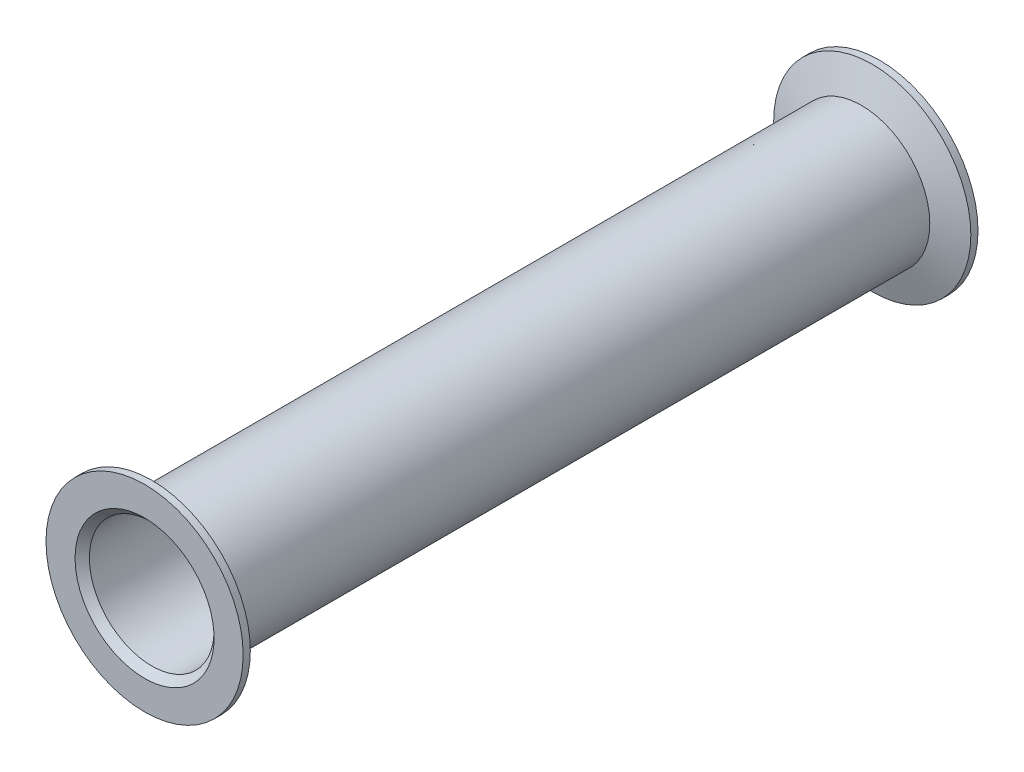
ISO-10303-21;
HEADER;
FILE_DESCRIPTION(('STEP AP214'),'2;1');
FILE_NAME('part.step','',(''),(''),'','','');
FILE_SCHEMA(('AUTOMOTIVE_DESIGN { 1 0 10303 214 1 1 1 1 }'));
ENDSEC;
DATA;
#1=APPLICATION_CONTEXT('core data for automotive mechanical design processes');
#2=APPLICATION_PROTOCOL_DEFINITION('international standard','automotive_design',2000,#1);
#3=PRODUCT_CONTEXT('',#1,'mechanical');
#4=PRODUCT('Part','Part','',(#3));
#5=PRODUCT_RELATED_PRODUCT_CATEGORY('part','',(#4));
#6=PRODUCT_DEFINITION_FORMATION('','',#4);
#7=PRODUCT_DEFINITION_CONTEXT('part definition',#1,'design');
#8=PRODUCT_DEFINITION('design','',#6,#7);
#9=PRODUCT_DEFINITION_SHAPE('','',#8);
#10=(LENGTH_UNIT() NAMED_UNIT(*) SI_UNIT(.MILLI.,.METRE.));
#11=(NAMED_UNIT(*) PLANE_ANGLE_UNIT() SI_UNIT($,.RADIAN.));
#12=(NAMED_UNIT(*) SI_UNIT($,.STERADIAN.) SOLID_ANGLE_UNIT());
#13=UNCERTAINTY_MEASURE_WITH_UNIT(LENGTH_MEASURE(1.E-05),#10,'distance_accuracy_value','');
#14=(GEOMETRIC_REPRESENTATION_CONTEXT(3) GLOBAL_UNCERTAINTY_ASSIGNED_CONTEXT((#13)) GLOBAL_UNIT_ASSIGNED_CONTEXT((#10,
#11,#12)) REPRESENTATION_CONTEXT('',''));
#15=CARTESIAN_POINT('',(0.,0.,0.));
#16=DIRECTION('',(0.,0.,1.));
#17=DIRECTION('',(1.,0.,0.));
#18=AXIS2_PLACEMENT_3D('',#15,#16,#17);
#19=CARTESIAN_POINT('',(0.,0.,97.5));
#20=DIRECTION('',(0.,0.,-1.));
#21=DIRECTION('',(-1.,0.,0.));
#22=AXIS2_PLACEMENT_3D('',#19,#20,#21);
#23=CYLINDRICAL_SURFACE('',#22,19.05);
#24=CARTESIAN_POINT('',(0.,0.,97.5));
#25=DIRECTION('',(0.,0.,1.));
#26=DIRECTION('',(1.,0.,0.));
#27=AXIS2_PLACEMENT_3D('',#24,#25,#26);
#28=CIRCLE('',#27,19.05);
#29=CARTESIAN_POINT('',(19.05,0.,97.5));
#30=VERTEX_POINT('',#29);
#31=EDGE_CURVE('E64',#30,#30,#28,.T.);
#32=ORIENTED_EDGE('',*,*,#31,.F.);
#33=EDGE_LOOP('',(#32));
#34=FACE_BOUND('',#33,.T.);
#35=CARTESIAN_POINT('',(0.,0.,-97.5));
#36=DIRECTION('',(0.,0.,1.));
#37=DIRECTION('',(1.,0.,0.));
#38=AXIS2_PLACEMENT_3D('',#35,#36,#37);
#39=CIRCLE('',#38,19.05);
#40=CARTESIAN_POINT('',(19.05,0.,-97.5));
#41=VERTEX_POINT('',#40);
#42=EDGE_CURVE('E79',#41,#41,#39,.T.);
#43=ORIENTED_EDGE('',*,*,#42,.T.);
#44=EDGE_LOOP('',(#43));
#45=FACE_BOUND('',#44,.T.);
#46=ADVANCED_FACE('F43',(#34,#45),#23,.T.);
#47=CARTESIAN_POINT('',(0.,0.,102.5));
#48=DIRECTION('',(0.,0.,-1.));
#49=DIRECTION('',(-1.,0.,0.));
#50=AXIS2_PLACEMENT_3D('',#47,#48,#49);
#51=PLANE('',#50);
#52=CARTESIAN_POINT('',(0.,0.,102.5));
#53=DIRECTION('',(0.,0.,-1.));
#54=DIRECTION('',(-1.,0.,0.));
#55=AXIS2_PLACEMENT_3D('',#52,#53,#54);
#56=CIRCLE('',#55,19.4000000000001);
#57=CARTESIAN_POINT('',(-19.4000000000001,0.,102.5));
#58=VERTEX_POINT('',#57);
#59=EDGE_CURVE('E10',#58,#58,#56,.T.);
#60=ORIENTED_EDGE('',*,*,#59,.T.);
#61=EDGE_LOOP('',(#60));
#62=FACE_BOUND('',#61,.T.);
#63=CARTESIAN_POINT('',(0.,0.,102.5));
#64=DIRECTION('',(0.,0.,1.));
#65=DIRECTION('',(1.,0.,0.));
#66=AXIS2_PLACEMENT_3D('',#63,#64,#65);
#67=CIRCLE('',#66,27.5);
#68=CARTESIAN_POINT('',(27.5,0.,102.5));
#69=VERTEX_POINT('',#68);
#70=EDGE_CURVE('E70',#69,#69,#67,.T.);
#71=ORIENTED_EDGE('',*,*,#70,.T.);
#72=EDGE_LOOP('',(#71));
#73=FACE_BOUND('',#72,.T.);
#74=ADVANCED_FACE('F110',(#62,#73),#51,.F.);
#75=CARTESIAN_POINT('',(0.,0.,100.5));
#76=DIRECTION('',(0.,0.,1.));
#77=DIRECTION('',(1.,0.,0.));
#78=AXIS2_PLACEMENT_3D('',#75,#76,#77);
#79=CONICAL_SURFACE('',#78,27.5,1.2296478530425);
#80=ORIENTED_EDGE('',*,*,#31,.T.);
#81=EDGE_LOOP('',(#80));
#82=FACE_BOUND('',#81,.T.);
#83=CARTESIAN_POINT('',(0.,0.,100.5));
#84=DIRECTION('',(0.,0.,1.));
#85=DIRECTION('',(1.,0.,0.));
#86=AXIS2_PLACEMENT_3D('',#83,#84,#85);
#87=CIRCLE('',#86,27.5);
#88=CARTESIAN_POINT('',(27.5,0.,100.5));
#89=VERTEX_POINT('',#88);
#90=EDGE_CURVE('E67',#89,#89,#87,.T.);
#91=ORIENTED_EDGE('',*,*,#90,.F.);
#92=EDGE_LOOP('',(#91));
#93=FACE_BOUND('',#92,.T.);
#94=ADVANCED_FACE('F106',(#82,#93),#79,.T.);
#95=CARTESIAN_POINT('',(0.,0.,102.5));
#96=DIRECTION('',(0.,0.,1.));
#97=DIRECTION('',(1.,0.,0.));
#98=AXIS2_PLACEMENT_3D('',#95,#96,#97);
#99=CYLINDRICAL_SURFACE('',#98,27.5);
#100=ORIENTED_EDGE('',*,*,#90,.T.);
#101=EDGE_LOOP('',(#100));
#102=FACE_BOUND('',#101,.T.);
#103=ORIENTED_EDGE('',*,*,#70,.F.);
#104=EDGE_LOOP('',(#103));
#105=FACE_BOUND('',#104,.T.);
#106=ADVANCED_FACE('F99',(#102,#105),#99,.T.);
#107=CARTESIAN_POINT('',(0.,0.,-102.5));
#108=DIRECTION('',(0.,0.,1.));
#109=DIRECTION('',(1.,0.,0.));
#110=AXIS2_PLACEMENT_3D('',#107,#108,#109);
#111=PLANE('',#110);
#112=CARTESIAN_POINT('',(0.,0.,-102.5));
#113=DIRECTION('',(0.,0.,1.));
#114=DIRECTION('',(1.,0.,0.));
#115=AXIS2_PLACEMENT_3D('',#112,#113,#114);
#116=CIRCLE('',#115,19.4);
#117=CARTESIAN_POINT('',(19.4,0.,-102.5));
#118=VERTEX_POINT('',#117);
#119=EDGE_CURVE('E51',#118,#118,#116,.T.);
#120=ORIENTED_EDGE('',*,*,#119,.T.);
#121=EDGE_LOOP('',(#120));
#122=FACE_BOUND('',#121,.T.);
#123=CARTESIAN_POINT('',(0.,0.,-102.5));
#124=DIRECTION('',(0.,0.,1.));
#125=DIRECTION('',(1.,0.,0.));
#126=AXIS2_PLACEMENT_3D('',#123,#124,#125);
#127=CIRCLE('',#126,27.5);
#128=CARTESIAN_POINT('',(27.5,0.,-102.5));
#129=VERTEX_POINT('',#128);
#130=EDGE_CURVE('E73',#129,#129,#127,.T.);
#131=ORIENTED_EDGE('',*,*,#130,.F.);
#132=EDGE_LOOP('',(#131));
#133=FACE_BOUND('',#132,.T.);
#134=ADVANCED_FACE('F94',(#122,#133),#111,.F.);
#135=CARTESIAN_POINT('',(0.,0.,102.5));
#136=DIRECTION('',(0.,0.,1.));
#137=DIRECTION('',(1.,0.,0.));
#138=AXIS2_PLACEMENT_3D('',#135,#136,#137);
#139=CYLINDRICAL_SURFACE('',#138,27.5);
#140=CARTESIAN_POINT('',(0.,0.,-100.5));
#141=DIRECTION('',(0.,0.,1.));
#142=DIRECTION('',(1.,0.,0.));
#143=AXIS2_PLACEMENT_3D('',#140,#141,#142);
#144=CIRCLE('',#143,27.5);
#145=CARTESIAN_POINT('',(27.5,0.,-100.5));
#146=VERTEX_POINT('',#145);
#147=EDGE_CURVE('E76',#146,#146,#144,.T.);
#148=ORIENTED_EDGE('',*,*,#147,.F.);
#149=EDGE_LOOP('',(#148));
#150=FACE_BOUND('',#149,.T.);
#151=ORIENTED_EDGE('',*,*,#130,.T.);
#152=EDGE_LOOP('',(#151));
#153=FACE_BOUND('',#152,.T.);
#154=ADVANCED_FACE('F88',(#150,#153),#139,.T.);
#155=CARTESIAN_POINT('',(0.,0.,-100.5));
#156=DIRECTION('',(0.,0.,-1.));
#157=DIRECTION('',(-1.,0.,0.));
#158=AXIS2_PLACEMENT_3D('',#155,#156,#157);
#159=CONICAL_SURFACE('',#158,27.5,1.2296478530425);
#160=ORIENTED_EDGE('',*,*,#42,.F.);
#161=EDGE_LOOP('',(#160));
#162=FACE_BOUND('',#161,.T.);
#163=ORIENTED_EDGE('',*,*,#147,.T.);
#164=EDGE_LOOP('',(#163));
#165=FACE_BOUND('',#164,.T.);
#166=ADVANCED_FACE('F84',(#162,#165),#159,.T.);
#167=CARTESIAN_POINT('',(0.,0.,97.5));
#168=DIRECTION('',(0.,0.,-1.));
#169=DIRECTION('',(-1.,0.,0.));
#170=AXIS2_PLACEMENT_3D('',#167,#168,#169);
#171=CYLINDRICAL_SURFACE('',#170,17.4);
#172=CARTESIAN_POINT('',(0.,0.,-100.5));
#173=DIRECTION('',(0.,0.,1.));
#174=DIRECTION('',(1.,0.,0.));
#175=AXIS2_PLACEMENT_3D('',#172,#173,#174);
#176=CIRCLE('',#175,17.4);
#177=CARTESIAN_POINT('',(17.4,0.,-100.5));
#178=VERTEX_POINT('',#177);
#179=EDGE_CURVE('E55',#178,#178,#176,.F.);
#180=ORIENTED_EDGE('',*,*,#179,.T.);
#181=EDGE_LOOP('',(#180));
#182=FACE_BOUND('',#181,.T.);
#183=CARTESIAN_POINT('',(0.,0.,100.5));
#184=DIRECTION('',(0.,0.,-1.));
#185=DIRECTION('',(-1.,0.,0.));
#186=AXIS2_PLACEMENT_3D('',#183,#184,#185);
#187=CIRCLE('',#186,17.4);
#188=CARTESIAN_POINT('',(-17.4,0.,100.5));
#189=VERTEX_POINT('',#188);
#190=EDGE_CURVE('E59',#189,#189,#187,.F.);
#191=ORIENTED_EDGE('',*,*,#190,.T.);
#192=EDGE_LOOP('',(#191));
#193=FACE_BOUND('',#192,.T.);
#194=ADVANCED_FACE('F87',(#182,#193),#171,.F.);
#195=CARTESIAN_POINT('',(0.,0.,-100.5));
#196=DIRECTION('',(0.,0.,-1.));
#197=DIRECTION('',(-1.,0.,0.));
#198=AXIS2_PLACEMENT_3D('',#195,#196,#197);
#199=CONICAL_SURFACE('',#198,17.4,0.785398163397455);
#200=ORIENTED_EDGE('',*,*,#119,.F.);
#201=EDGE_LOOP('',(#200));
#202=FACE_BOUND('',#201,.T.);
#203=ORIENTED_EDGE('',*,*,#179,.F.);
#204=EDGE_LOOP('',(#203));
#205=FACE_BOUND('',#204,.T.);
#206=ADVANCED_FACE('F120',(#202,#205),#199,.F.);
#207=CARTESIAN_POINT('',(0.,0.,102.5));
#208=DIRECTION('',(0.,0.,1.));
#209=DIRECTION('',(1.,0.,0.));
#210=AXIS2_PLACEMENT_3D('',#207,#208,#209);
#211=CONICAL_SURFACE('',#210,19.4000000000001,0.785398163397448);
#212=ORIENTED_EDGE('',*,*,#190,.F.);
#213=EDGE_LOOP('',(#212));
#214=FACE_BOUND('',#213,.T.);
#215=ORIENTED_EDGE('',*,*,#59,.F.);
#216=EDGE_LOOP('',(#215));
#217=FACE_BOUND('',#216,.T.);
#218=ADVANCED_FACE('F46',(#214,#217),#211,.F.);
#219=CLOSED_SHELL('',(#46,#74,#94,#106,#134,#154,#166,#194,#206,#218));
#220=MANIFOLD_SOLID_BREP('B2',#219);
#221=ADVANCED_BREP_SHAPE_REPRESENTATION('',(#18,#220),#14);
#222=SHAPE_DEFINITION_REPRESENTATION(#9,#221);
ENDSEC;
END-ISO-10303-21;
